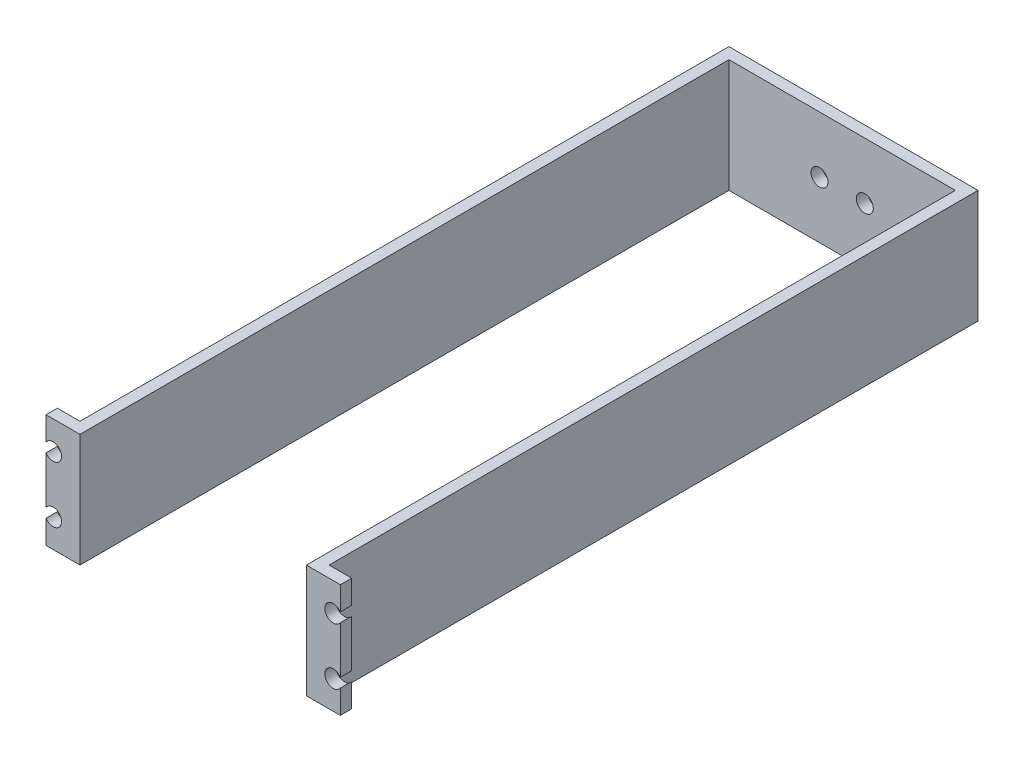
ISO-10303-21;
HEADER;
FILE_DESCRIPTION(('STEP AP214'),'2;1');
FILE_NAME('part.step','',(''),(''),'','','');
FILE_SCHEMA(('AUTOMOTIVE_DESIGN { 1 0 10303 214 1 1 1 1 }'));
ENDSEC;
DATA;
#1=APPLICATION_CONTEXT('core data for automotive mechanical design processes');
#2=APPLICATION_PROTOCOL_DEFINITION('international standard','automotive_design',2000,#1);
#3=PRODUCT_CONTEXT('',#1,'mechanical');
#4=PRODUCT('Part','Part','',(#3));
#5=PRODUCT_RELATED_PRODUCT_CATEGORY('part','',(#4));
#6=PRODUCT_DEFINITION_FORMATION('','',#4);
#7=PRODUCT_DEFINITION_CONTEXT('part definition',#1,'design');
#8=PRODUCT_DEFINITION('design','',#6,#7);
#9=PRODUCT_DEFINITION_SHAPE('','',#8);
#10=(LENGTH_UNIT() NAMED_UNIT(*) SI_UNIT(.MILLI.,.METRE.));
#11=(NAMED_UNIT(*) PLANE_ANGLE_UNIT() SI_UNIT($,.RADIAN.));
#12=(NAMED_UNIT(*) SI_UNIT($,.STERADIAN.) SOLID_ANGLE_UNIT());
#13=UNCERTAINTY_MEASURE_WITH_UNIT(LENGTH_MEASURE(1.E-05),#10,'distance_accuracy_value','');
#14=(GEOMETRIC_REPRESENTATION_CONTEXT(3) GLOBAL_UNCERTAINTY_ASSIGNED_CONTEXT((#13)) GLOBAL_UNIT_ASSIGNED_CONTEXT((#10,
#11,#12)) REPRESENTATION_CONTEXT('',''));
#15=CARTESIAN_POINT('',(0.,0.,0.));
#16=DIRECTION('',(0.,0.,1.));
#17=DIRECTION('',(1.,0.,0.));
#18=AXIS2_PLACEMENT_3D('',#15,#16,#17);
#19=CARTESIAN_POINT('',(-4.,0.,0.));
#20=DIRECTION('',(1.,0.,0.));
#21=DIRECTION('',(0.,0.,-1.));
#22=AXIS2_PLACEMENT_3D('',#19,#20,#21);
#23=PLANE('',#22);
#24=DIRECTION('',(0.,-1.,0.));
#25=VECTOR('',#24,1.);
#26=CARTESIAN_POINT('',(-4.,20.,114.65));
#27=LINE('',#26,#25);
#28=CARTESIAN_POINT('',(-4.,20.,114.65));
#29=VERTEX_POINT('',#28);
#30=CARTESIAN_POINT('',(-4.,15.8291561975888,114.65));
#31=VERTEX_POINT('',#30);
#32=EDGE_CURVE('E234',#29,#31,#27,.T.);
#33=ORIENTED_EDGE('',*,*,#32,.T.);
#34=DIRECTION('',(0.,0.,1.));
#35=VECTOR('',#34,1.);
#36=CARTESIAN_POINT('',(-4.,15.8291561975888,112.65));
#37=LINE('',#36,#35);
#38=CARTESIAN_POINT('',(-4.,15.8291561975888,116.65));
#39=VERTEX_POINT('',#38);
#40=EDGE_CURVE('E11',#31,#39,#37,.T.);
#41=ORIENTED_EDGE('',*,*,#40,.T.);
#42=DIRECTION('',(0.,1.,0.));
#43=VECTOR('',#42,1.);
#44=CARTESIAN_POINT('',(-4.,20.,116.65));
#45=LINE('',#44,#43);
#46=CARTESIAN_POINT('',(-4.,20.,116.65));
#47=VERTEX_POINT('',#46);
#48=EDGE_CURVE('E231',#39,#47,#45,.T.);
#49=ORIENTED_EDGE('',*,*,#48,.T.);
#50=DIRECTION('',(0.,0.,-1.));
#51=VECTOR('',#50,1.);
#52=CARTESIAN_POINT('',(-4.,20.,116.65));
#53=LINE('',#52,#51);
#54=EDGE_CURVE('E229',#47,#29,#53,.T.);
#55=ORIENTED_EDGE('',*,*,#54,.T.);
#56=EDGE_LOOP('',(#33,#41,#49,#55));
#57=FACE_BOUND('',#56,.T.);
#58=ADVANCED_FACE('F35',(#57),#23,.F.);
#59=CARTESIAN_POINT('',(-4.,5.82915619758885,116.65));
#60=VERTEX_POINT('',#59);
#61=CARTESIAN_POINT('',(-4.,14.1708438024112,116.65));
#62=VERTEX_POINT('',#61);
#63=EDGE_CURVE('E230',#60,#62,#45,.T.);
#64=ORIENTED_EDGE('',*,*,#63,.T.);
#65=DIRECTION('',(0.,0.,1.));
#66=VECTOR('',#65,1.);
#67=CARTESIAN_POINT('',(-4.,14.1708438024112,112.65));
#68=LINE('',#67,#66);
#69=CARTESIAN_POINT('',(-4.,14.1708438024112,114.65));
#70=VERTEX_POINT('',#69);
#71=EDGE_CURVE('E43',#62,#70,#68,.F.);
#72=ORIENTED_EDGE('',*,*,#71,.T.);
#73=CARTESIAN_POINT('',(-4.,5.82915619758885,114.65));
#74=VERTEX_POINT('',#73);
#75=EDGE_CURVE('E238',#70,#74,#27,.T.);
#76=ORIENTED_EDGE('',*,*,#75,.T.);
#77=DIRECTION('',(0.,0.,1.));
#78=VECTOR('',#77,1.);
#79=CARTESIAN_POINT('',(-4.,5.82915619758885,112.65));
#80=LINE('',#79,#78);
#81=EDGE_CURVE('E315',#74,#60,#80,.T.);
#82=ORIENTED_EDGE('',*,*,#81,.T.);
#83=EDGE_LOOP('',(#64,#72,#76,#82));
#84=FACE_BOUND('',#83,.T.);
#85=ADVANCED_FACE('F321',(#84),#23,.F.);
#86=CARTESIAN_POINT('',(48.,0.,0.));
#87=DIRECTION('',(1.,0.,0.));
#88=DIRECTION('',(0.,0.,-1.));
#89=AXIS2_PLACEMENT_3D('',#86,#87,#88);
#90=PLANE('',#89);
#91=DIRECTION('',(0.,0.,1.));
#92=VECTOR('',#91,1.);
#93=CARTESIAN_POINT('',(48.,5.82915619758885,112.65));
#94=LINE('',#93,#92);
#95=CARTESIAN_POINT('',(48.,5.82915619758885,114.65));
#96=VERTEX_POINT('',#95);
#97=CARTESIAN_POINT('',(48.,5.82915619758885,116.65));
#98=VERTEX_POINT('',#97);
#99=EDGE_CURVE('E171',#96,#98,#94,.T.);
#100=ORIENTED_EDGE('',*,*,#99,.F.);
#101=DIRECTION('',(0.,1.,0.));
#102=VECTOR('',#101,1.);
#103=CARTESIAN_POINT('',(48.,20.,114.65));
#104=LINE('',#103,#102);
#105=CARTESIAN_POINT('',(48.,14.1708438024112,114.65));
#106=VERTEX_POINT('',#105);
#107=EDGE_CURVE('E213',#96,#106,#104,.T.);
#108=ORIENTED_EDGE('',*,*,#107,.T.);
#109=DIRECTION('',(0.,0.,1.));
#110=VECTOR('',#109,1.);
#111=CARTESIAN_POINT('',(48.,14.1708438024112,112.65));
#112=LINE('',#111,#110);
#113=CARTESIAN_POINT('',(48.,14.1708438024112,116.65));
#114=VERTEX_POINT('',#113);
#115=EDGE_CURVE('E197',#114,#106,#112,.F.);
#116=ORIENTED_EDGE('',*,*,#115,.F.);
#117=DIRECTION('',(0.,-1.,0.));
#118=VECTOR('',#117,1.);
#119=CARTESIAN_POINT('',(48.,20.,116.65));
#120=LINE('',#119,#118);
#121=EDGE_CURVE('E189',#114,#98,#120,.T.);
#122=ORIENTED_EDGE('',*,*,#121,.T.);
#123=EDGE_LOOP('',(#100,#108,#116,#122));
#124=FACE_BOUND('',#123,.T.);
#125=ADVANCED_FACE('F195',(#124),#90,.T.);
#126=DIRECTION('',(0.,0.,1.));
#127=VECTOR('',#126,1.);
#128=CARTESIAN_POINT('',(48.,15.8291561975888,112.65));
#129=LINE('',#128,#127);
#130=CARTESIAN_POINT('',(48.,15.8291561975888,114.65));
#131=VERTEX_POINT('',#130);
#132=CARTESIAN_POINT('',(48.,15.8291561975888,116.65));
#133=VERTEX_POINT('',#132);
#134=EDGE_CURVE('E311',#131,#133,#129,.T.);
#135=ORIENTED_EDGE('',*,*,#134,.F.);
#136=CARTESIAN_POINT('',(48.,20.,114.65));
#137=VERTEX_POINT('',#136);
#138=EDGE_CURVE('E208',#131,#137,#104,.T.);
#139=ORIENTED_EDGE('',*,*,#138,.T.);
#140=DIRECTION('',(0.,0.,1.));
#141=VECTOR('',#140,1.);
#142=CARTESIAN_POINT('',(48.,20.,116.65));
#143=LINE('',#142,#141);
#144=CARTESIAN_POINT('',(48.,20.,116.65));
#145=VERTEX_POINT('',#144);
#146=EDGE_CURVE('E212',#137,#145,#143,.T.);
#147=ORIENTED_EDGE('',*,*,#146,.T.);
#148=EDGE_CURVE('E198',#145,#133,#120,.T.);
#149=ORIENTED_EDGE('',*,*,#148,.T.);
#150=EDGE_LOOP('',(#135,#139,#147,#149));
#151=FACE_BOUND('',#150,.T.);
#152=ADVANCED_FACE('F384',(#151),#90,.T.);
#153=CARTESIAN_POINT('',(44.,0.,2.));
#154=DIRECTION('',(-1.,0.,0.));
#155=DIRECTION('',(0.,0.,1.));
#156=AXIS2_PLACEMENT_3D('',#153,#154,#155);
#157=PLANE('',#156);
#158=DIRECTION('',(0.,1.,0.));
#159=VECTOR('',#158,1.);
#160=CARTESIAN_POINT('',(44.,20.,114.65));
#161=LINE('',#160,#159);
#162=CARTESIAN_POINT('',(44.,0.,114.65));
#163=VERTEX_POINT('',#162);
#164=CARTESIAN_POINT('',(44.,20.,114.65));
#165=VERTEX_POINT('',#164);
#166=EDGE_CURVE('E202',#163,#165,#161,.T.);
#167=ORIENTED_EDGE('',*,*,#166,.F.);
#168=DIRECTION('',(0.,0.,-1.));
#169=VECTOR('',#168,1.);
#170=CARTESIAN_POINT('',(44.,0.,2.));
#171=LINE('',#170,#169);
#172=CARTESIAN_POINT('',(44.,0.,0.));
#173=VERTEX_POINT('',#172);
#174=EDGE_CURVE('E300',#163,#173,#171,.T.);
#175=ORIENTED_EDGE('',*,*,#174,.T.);
#176=DIRECTION('',(0.,1.,0.));
#177=VECTOR('',#176,1.);
#178=CARTESIAN_POINT('',(44.,0.,0.));
#179=LINE('',#178,#177);
#180=CARTESIAN_POINT('',(44.,20.,0.));
#181=VERTEX_POINT('',#180);
#182=EDGE_CURVE('E292',#173,#181,#179,.T.);
#183=ORIENTED_EDGE('',*,*,#182,.T.);
#184=DIRECTION('',(0.,0.,-1.));
#185=VECTOR('',#184,1.);
#186=CARTESIAN_POINT('',(44.,20.,2.));
#187=LINE('',#186,#185);
#188=EDGE_CURVE('E298',#165,#181,#187,.T.);
#189=ORIENTED_EDGE('',*,*,#188,.F.);
#190=EDGE_LOOP('',(#167,#175,#183,#189));
#191=FACE_BOUND('',#190,.T.);
#192=ADVANCED_FACE('F392',(#191),#157,.F.);
#193=CARTESIAN_POINT('',(0.,0.,2.));
#194=DIRECTION('',(1.,0.,0.));
#195=DIRECTION('',(0.,0.,-1.));
#196=AXIS2_PLACEMENT_3D('',#193,#194,#195);
#197=PLANE('',#196);
#198=DIRECTION('',(0.,-1.,0.));
#199=VECTOR('',#198,1.);
#200=CARTESIAN_POINT('',(0.,20.,114.65));
#201=LINE('',#200,#199);
#202=CARTESIAN_POINT('',(0.,20.,114.65));
#203=VERTEX_POINT('',#202);
#204=CARTESIAN_POINT('',(0.,0.,114.65));
#205=VERTEX_POINT('',#204);
#206=EDGE_CURVE('E225',#203,#205,#201,.T.);
#207=ORIENTED_EDGE('',*,*,#206,.F.);
#208=DIRECTION('',(0.,0.,-1.));
#209=VECTOR('',#208,1.);
#210=CARTESIAN_POINT('',(0.,20.,2.));
#211=LINE('',#210,#209);
#212=CARTESIAN_POINT('',(0.,20.,0.));
#213=VERTEX_POINT('',#212);
#214=EDGE_CURVE('E286',#203,#213,#211,.T.);
#215=ORIENTED_EDGE('',*,*,#214,.T.);
#216=DIRECTION('',(0.,-1.,0.));
#217=VECTOR('',#216,1.);
#218=CARTESIAN_POINT('',(0.,0.,0.));
#219=LINE('',#218,#217);
#220=CARTESIAN_POINT('',(0.,0.,0.));
#221=VERTEX_POINT('',#220);
#222=EDGE_CURVE('E280',#213,#221,#219,.T.);
#223=ORIENTED_EDGE('',*,*,#222,.T.);
#224=DIRECTION('',(0.,0.,-1.));
#225=VECTOR('',#224,1.);
#226=CARTESIAN_POINT('',(0.,0.,2.));
#227=LINE('',#226,#225);
#228=EDGE_CURVE('E302',#205,#221,#227,.T.);
#229=ORIENTED_EDGE('',*,*,#228,.F.);
#230=EDGE_LOOP('',(#207,#215,#223,#229));
#231=FACE_BOUND('',#230,.T.);
#232=ADVANCED_FACE('F37',(#231),#197,.F.);
#233=CARTESIAN_POINT('',(0.,0.,2.));
#234=DIRECTION('',(0.,0.,-1.));
#235=DIRECTION('',(-1.,0.,0.));
#236=AXIS2_PLACEMENT_3D('',#233,#234,#235);
#237=PLANE('',#236);
#238=CARTESIAN_POINT('',(26.,10.,2.));
#239=DIRECTION('',(0.,0.,1.));
#240=DIRECTION('',(1.,0.,0.));
#241=AXIS2_PLACEMENT_3D('',#238,#239,#240);
#242=CIRCLE('',#241,1.5);
#243=CARTESIAN_POINT('',(27.5,10.,2.));
#244=VERTEX_POINT('',#243);
#245=EDGE_CURVE('E309',#244,#244,#242,.T.);
#246=ORIENTED_EDGE('',*,*,#245,.F.);
#247=EDGE_LOOP('',(#246));
#248=FACE_BOUND('',#247,.T.);
#249=CARTESIAN_POINT('',(18.,10.,2.));
#250=DIRECTION('',(0.,0.,1.));
#251=DIRECTION('',(1.,0.,0.));
#252=AXIS2_PLACEMENT_3D('',#249,#250,#251);
#253=CIRCLE('',#252,1.5);
#254=CARTESIAN_POINT('',(19.5,10.,2.));
#255=VERTEX_POINT('',#254);
#256=EDGE_CURVE('E205',#255,#255,#253,.T.);
#257=ORIENTED_EDGE('',*,*,#256,.F.);
#258=EDGE_LOOP('',(#257));
#259=FACE_BOUND('',#258,.T.);
#260=DIRECTION('',(0.,-1.,0.));
#261=VECTOR('',#260,1.);
#262=CARTESIAN_POINT('',(42.,20.,2.));
#263=LINE('',#262,#261);
#264=CARTESIAN_POINT('',(42.,20.,2.));
#265=VERTEX_POINT('',#264);
#266=CARTESIAN_POINT('',(42.,0.,2.));
#267=VERTEX_POINT('',#266);
#268=EDGE_CURVE('E249',#265,#267,#263,.T.);
#269=ORIENTED_EDGE('',*,*,#268,.F.);
#270=DIRECTION('',(-1.,0.,0.));
#271=VECTOR('',#270,1.);
#272=CARTESIAN_POINT('',(0.,20.,2.));
#273=LINE('',#272,#271);
#274=CARTESIAN_POINT('',(2.,20.,2.));
#275=VERTEX_POINT('',#274);
#276=EDGE_CURVE('E283',#265,#275,#273,.T.);
#277=ORIENTED_EDGE('',*,*,#276,.T.);
#278=DIRECTION('',(0.,1.,0.));
#279=VECTOR('',#278,1.);
#280=CARTESIAN_POINT('',(2.,20.,2.));
#281=LINE('',#280,#279);
#282=CARTESIAN_POINT('',(2.,0.,2.));
#283=VERTEX_POINT('',#282);
#284=EDGE_CURVE('E264',#283,#275,#281,.T.);
#285=ORIENTED_EDGE('',*,*,#284,.F.);
#286=DIRECTION('',(1.,0.,0.));
#287=VECTOR('',#286,1.);
#288=CARTESIAN_POINT('',(0.,0.,2.));
#289=LINE('',#288,#287);
#290=EDGE_CURVE('E281',#283,#267,#289,.T.);
#291=ORIENTED_EDGE('',*,*,#290,.T.);
#292=EDGE_LOOP('',(#269,#277,#285,#291));
#293=FACE_BOUND('',#292,.T.);
#294=ADVANCED_FACE('F358',(#248,#259,#293),#237,.F.);
#295=CARTESIAN_POINT('',(0.,0.,2.));
#296=DIRECTION('',(0.,1.,0.));
#297=DIRECTION('',(0.,0.,1.));
#298=AXIS2_PLACEMENT_3D('',#295,#296,#297);
#299=PLANE('',#298);
#300=DIRECTION('',(1.,0.,0.));
#301=VECTOR('',#300,1.);
#302=CARTESIAN_POINT('',(0.,0.,0.));
#303=LINE('',#302,#301);
#304=EDGE_CURVE('E289',#221,#173,#303,.T.);
#305=ORIENTED_EDGE('',*,*,#304,.T.);
#306=ORIENTED_EDGE('',*,*,#174,.F.);
#307=DIRECTION('',(-1.,0.,0.));
#308=VECTOR('',#307,1.);
#309=CARTESIAN_POINT('',(48.,0.,114.65));
#310=LINE('',#309,#308);
#311=CARTESIAN_POINT('',(48.,0.,114.65));
#312=VERTEX_POINT('',#311);
#313=EDGE_CURVE('E222',#312,#163,#310,.T.);
#314=ORIENTED_EDGE('',*,*,#313,.F.);
#315=DIRECTION('',(0.,0.,-1.));
#316=VECTOR('',#315,1.);
#317=CARTESIAN_POINT('',(48.,0.,116.65));
#318=LINE('',#317,#316);
#319=CARTESIAN_POINT('',(48.,0.,116.65));
#320=VERTEX_POINT('',#319);
#321=EDGE_CURVE('E201',#320,#312,#318,.T.);
#322=ORIENTED_EDGE('',*,*,#321,.F.);
#323=DIRECTION('',(1.,0.,0.));
#324=VECTOR('',#323,1.);
#325=CARTESIAN_POINT('',(44.,0.,116.65));
#326=LINE('',#325,#324);
#327=CARTESIAN_POINT('',(42.,0.,116.65));
#328=VERTEX_POINT('',#327);
#329=EDGE_CURVE('E254',#328,#320,#326,.T.);
#330=ORIENTED_EDGE('',*,*,#329,.F.);
#331=DIRECTION('',(0.,0.,-1.));
#332=VECTOR('',#331,1.);
#333=CARTESIAN_POINT('',(42.,0.,116.65));
#334=LINE('',#333,#332);
#335=EDGE_CURVE('E256',#328,#267,#334,.T.);
#336=ORIENTED_EDGE('',*,*,#335,.T.);
#337=ORIENTED_EDGE('',*,*,#290,.F.);
#338=DIRECTION('',(0.,0.,-1.));
#339=VECTOR('',#338,1.);
#340=CARTESIAN_POINT('',(2.,0.,116.65));
#341=LINE('',#340,#339);
#342=CARTESIAN_POINT('',(2.,0.,116.65));
#343=VERTEX_POINT('',#342);
#344=EDGE_CURVE('E277',#343,#283,#341,.T.);
#345=ORIENTED_EDGE('',*,*,#344,.F.);
#346=DIRECTION('',(1.,0.,0.));
#347=VECTOR('',#346,1.);
#348=CARTESIAN_POINT('',(0.,0.,116.65));
#349=LINE('',#348,#347);
#350=CARTESIAN_POINT('',(-4.,0.,116.65));
#351=VERTEX_POINT('',#350);
#352=EDGE_CURVE('E265',#351,#343,#349,.T.);
#353=ORIENTED_EDGE('',*,*,#352,.F.);
#354=DIRECTION('',(0.,0.,1.));
#355=VECTOR('',#354,1.);
#356=CARTESIAN_POINT('',(-4.,0.,116.65));
#357=LINE('',#356,#355);
#358=CARTESIAN_POINT('',(-4.,0.,114.65));
#359=VERTEX_POINT('',#358);
#360=EDGE_CURVE('E237',#359,#351,#357,.T.);
#361=ORIENTED_EDGE('',*,*,#360,.F.);
#362=DIRECTION('',(1.,0.,0.));
#363=VECTOR('',#362,1.);
#364=CARTESIAN_POINT('',(-4.,0.,114.65));
#365=LINE('',#364,#363);
#366=EDGE_CURVE('E241',#359,#205,#365,.T.);
#367=ORIENTED_EDGE('',*,*,#366,.T.);
#368=ORIENTED_EDGE('',*,*,#228,.T.);
#369=EDGE_LOOP('',(#305,#306,#314,#322,#330,#336,#337,#345,#353,#361,#367,#368));
#370=FACE_BOUND('',#369,.T.);
#371=ADVANCED_FACE('F334',(#370),#299,.F.);
#372=CARTESIAN_POINT('',(0.,20.,2.));
#373=DIRECTION('',(0.,-1.,0.));
#374=DIRECTION('',(0.,0.,-1.));
#375=AXIS2_PLACEMENT_3D('',#372,#373,#374);
#376=PLANE('',#375);
#377=DIRECTION('',(-1.,0.,0.));
#378=VECTOR('',#377,1.);
#379=CARTESIAN_POINT('',(0.,20.,0.));
#380=LINE('',#379,#378);
#381=EDGE_CURVE('E284',#181,#213,#380,.T.);
#382=ORIENTED_EDGE('',*,*,#381,.T.);
#383=ORIENTED_EDGE('',*,*,#214,.F.);
#384=DIRECTION('',(1.,0.,0.));
#385=VECTOR('',#384,1.);
#386=CARTESIAN_POINT('',(-4.,20.,114.65));
#387=LINE('',#386,#385);
#388=EDGE_CURVE('E246',#29,#203,#387,.T.);
#389=ORIENTED_EDGE('',*,*,#388,.F.);
#390=ORIENTED_EDGE('',*,*,#54,.F.);
#391=DIRECTION('',(-1.,0.,0.));
#392=VECTOR('',#391,1.);
#393=CARTESIAN_POINT('',(0.,20.,116.65));
#394=LINE('',#393,#392);
#395=CARTESIAN_POINT('',(2.,20.,116.65));
#396=VERTEX_POINT('',#395);
#397=EDGE_CURVE('E269',#396,#47,#394,.T.);
#398=ORIENTED_EDGE('',*,*,#397,.F.);
#399=DIRECTION('',(0.,0.,-1.));
#400=VECTOR('',#399,1.);
#401=CARTESIAN_POINT('',(2.,20.,116.65));
#402=LINE('',#401,#400);
#403=EDGE_CURVE('E272',#396,#275,#402,.T.);
#404=ORIENTED_EDGE('',*,*,#403,.T.);
#405=ORIENTED_EDGE('',*,*,#276,.F.);
#406=DIRECTION('',(0.,0.,-1.));
#407=VECTOR('',#406,1.);
#408=CARTESIAN_POINT('',(42.,20.,116.65));
#409=LINE('',#408,#407);
#410=CARTESIAN_POINT('',(42.,20.,116.65));
#411=VERTEX_POINT('',#410);
#412=EDGE_CURVE('E261',#411,#265,#409,.T.);
#413=ORIENTED_EDGE('',*,*,#412,.F.);
#414=DIRECTION('',(-1.,0.,0.));
#415=VECTOR('',#414,1.);
#416=CARTESIAN_POINT('',(44.,20.,116.65));
#417=LINE('',#416,#415);
#418=EDGE_CURVE('E250',#145,#411,#417,.T.);
#419=ORIENTED_EDGE('',*,*,#418,.F.);
#420=ORIENTED_EDGE('',*,*,#146,.F.);
#421=DIRECTION('',(-1.,0.,0.));
#422=VECTOR('',#421,1.);
#423=CARTESIAN_POINT('',(48.,20.,114.65));
#424=LINE('',#423,#422);
#425=EDGE_CURVE('E216',#137,#165,#424,.T.);
#426=ORIENTED_EDGE('',*,*,#425,.T.);
#427=ORIENTED_EDGE('',*,*,#188,.T.);
#428=EDGE_LOOP('',(#382,#383,#389,#390,#398,#404,#405,#413,#419,#420,#426,#427));
#429=FACE_BOUND('',#428,.T.);
#430=ADVANCED_FACE('F372',(#429),#376,.F.);
#431=CARTESIAN_POINT('',(0.,0.,0.));
#432=DIRECTION('',(0.,0.,-1.));
#433=DIRECTION('',(-1.,0.,0.));
#434=AXIS2_PLACEMENT_3D('',#431,#432,#433);
#435=PLANE('',#434);
#436=CARTESIAN_POINT('',(26.,10.,0.));
#437=DIRECTION('',(0.,0.,-1.));
#438=DIRECTION('',(-1.,0.,0.));
#439=AXIS2_PLACEMENT_3D('',#436,#437,#438);
#440=CIRCLE('',#439,1.5);
#441=CARTESIAN_POINT('',(24.5,10.,0.));
#442=VERTEX_POINT('',#441);
#443=EDGE_CURVE('E306',#442,#442,#440,.T.);
#444=ORIENTED_EDGE('',*,*,#443,.F.);
#445=EDGE_LOOP('',(#444));
#446=FACE_BOUND('',#445,.T.);
#447=CARTESIAN_POINT('',(18.,10.,0.));
#448=DIRECTION('',(0.,0.,-1.));
#449=DIRECTION('',(-1.,0.,0.));
#450=AXIS2_PLACEMENT_3D('',#447,#448,#449);
#451=CIRCLE('',#450,1.5);
#452=CARTESIAN_POINT('',(16.5,10.,0.));
#453=VERTEX_POINT('',#452);
#454=EDGE_CURVE('E219',#453,#453,#451,.T.);
#455=ORIENTED_EDGE('',*,*,#454,.F.);
#456=EDGE_LOOP('',(#455));
#457=FACE_BOUND('',#456,.T.);
#458=ORIENTED_EDGE('',*,*,#222,.F.);
#459=ORIENTED_EDGE('',*,*,#381,.F.);
#460=ORIENTED_EDGE('',*,*,#182,.F.);
#461=ORIENTED_EDGE('',*,*,#304,.F.);
#462=EDGE_LOOP('',(#458,#459,#460,#461));
#463=FACE_BOUND('',#462,.T.);
#464=ADVANCED_FACE('F398',(#446,#457,#463),#435,.T.);
#465=CARTESIAN_POINT('',(2.,20.,116.65));
#466=DIRECTION('',(-1.,0.,0.));
#467=DIRECTION('',(0.,-1.,0.));
#468=AXIS2_PLACEMENT_3D('',#465,#466,#467);
#469=PLANE('',#468);
#470=ORIENTED_EDGE('',*,*,#284,.T.);
#471=ORIENTED_EDGE('',*,*,#403,.F.);
#472=DIRECTION('',(0.,1.,0.));
#473=VECTOR('',#472,1.);
#474=CARTESIAN_POINT('',(2.,20.,116.65));
#475=LINE('',#474,#473);
#476=EDGE_CURVE('E267',#343,#396,#475,.T.);
#477=ORIENTED_EDGE('',*,*,#476,.F.);
#478=ORIENTED_EDGE('',*,*,#344,.T.);
#479=EDGE_LOOP('',(#470,#471,#477,#478));
#480=FACE_BOUND('',#479,.T.);
#481=ADVANCED_FACE('F377',(#480),#469,.F.);
#482=CARTESIAN_POINT('',(0.,0.,116.65));
#483=DIRECTION('',(0.,0.,1.));
#484=DIRECTION('',(1.,0.,0.));
#485=AXIS2_PLACEMENT_3D('',#482,#483,#484);
#486=PLANE('',#485);
#487=CARTESIAN_POINT('',(-2.75,15.,116.65));
#488=DIRECTION('',(0.,0.,1.));
#489=DIRECTION('',(1.,0.,0.));
#490=AXIS2_PLACEMENT_3D('',#487,#488,#489);
#491=CIRCLE('',#490,1.5);
#492=EDGE_CURVE('E192',#62,#39,#491,.T.);
#493=ORIENTED_EDGE('',*,*,#492,.F.);
#494=ORIENTED_EDGE('',*,*,#63,.F.);
#495=CARTESIAN_POINT('',(-2.75,5.,116.65));
#496=DIRECTION('',(0.,0.,1.));
#497=DIRECTION('',(1.,0.,0.));
#498=AXIS2_PLACEMENT_3D('',#495,#496,#497);
#499=CIRCLE('',#498,1.5);
#500=CARTESIAN_POINT('',(-4.,4.17084380241115,116.65));
#501=VERTEX_POINT('',#500);
#502=EDGE_CURVE('E342',#501,#60,#499,.T.);
#503=ORIENTED_EDGE('',*,*,#502,.F.);
#504=EDGE_CURVE('E226',#351,#501,#45,.T.);
#505=ORIENTED_EDGE('',*,*,#504,.F.);
#506=ORIENTED_EDGE('',*,*,#352,.T.);
#507=ORIENTED_EDGE('',*,*,#476,.T.);
#508=ORIENTED_EDGE('',*,*,#397,.T.);
#509=ORIENTED_EDGE('',*,*,#48,.F.);
#510=EDGE_LOOP('',(#493,#494,#503,#505,#506,#507,#508,#509));
#511=FACE_BOUND('',#510,.T.);
#512=ADVANCED_FACE('F339',(#511),#486,.T.);
#513=CARTESIAN_POINT('',(42.,20.,116.65));
#514=DIRECTION('',(1.,0.,0.));
#515=DIRECTION('',(0.,0.,-1.));
#516=AXIS2_PLACEMENT_3D('',#513,#514,#515);
#517=PLANE('',#516);
#518=ORIENTED_EDGE('',*,*,#268,.T.);
#519=ORIENTED_EDGE('',*,*,#335,.F.);
#520=DIRECTION('',(0.,-1.,0.));
#521=VECTOR('',#520,1.);
#522=CARTESIAN_POINT('',(42.,20.,116.65));
#523=LINE('',#522,#521);
#524=EDGE_CURVE('E252',#411,#328,#523,.T.);
#525=ORIENTED_EDGE('',*,*,#524,.F.);
#526=ORIENTED_EDGE('',*,*,#412,.T.);
#527=EDGE_LOOP('',(#518,#519,#525,#526));
#528=FACE_BOUND('',#527,.T.);
#529=ADVANCED_FACE('F370',(#528),#517,.F.);
#530=CARTESIAN_POINT('',(0.,0.,116.65));
#531=DIRECTION('',(0.,0.,-1.));
#532=DIRECTION('',(-1.,0.,0.));
#533=AXIS2_PLACEMENT_3D('',#530,#531,#532);
#534=PLANE('',#533);
#535=CARTESIAN_POINT('',(48.,4.17084380241115,116.65));
#536=VERTEX_POINT('',#535);
#537=EDGE_CURVE('E191',#536,#320,#120,.T.);
#538=ORIENTED_EDGE('',*,*,#537,.F.);
#539=CARTESIAN_POINT('',(46.75,5.,116.65));
#540=DIRECTION('',(0.,0.,1.));
#541=DIRECTION('',(1.,0.,0.));
#542=AXIS2_PLACEMENT_3D('',#539,#540,#541);
#543=CIRCLE('',#542,1.5);
#544=EDGE_CURVE('E174',#98,#536,#543,.T.);
#545=ORIENTED_EDGE('',*,*,#544,.F.);
#546=ORIENTED_EDGE('',*,*,#121,.F.);
#547=CARTESIAN_POINT('',(46.75,15.,116.65));
#548=DIRECTION('',(0.,0.,1.));
#549=DIRECTION('',(1.,0.,0.));
#550=AXIS2_PLACEMENT_3D('',#547,#548,#549);
#551=CIRCLE('',#550,1.5);
#552=EDGE_CURVE('E349',#133,#114,#551,.T.);
#553=ORIENTED_EDGE('',*,*,#552,.F.);
#554=ORIENTED_EDGE('',*,*,#148,.F.);
#555=ORIENTED_EDGE('',*,*,#418,.T.);
#556=ORIENTED_EDGE('',*,*,#524,.T.);
#557=ORIENTED_EDGE('',*,*,#329,.T.);
#558=EDGE_LOOP('',(#538,#545,#546,#553,#554,#555,#556,#557));
#559=FACE_BOUND('',#558,.T.);
#560=ADVANCED_FACE('F187',(#559),#534,.F.);
#561=CARTESIAN_POINT('',(-4.,20.,114.65));
#562=DIRECTION('',(0.,0.,1.));
#563=DIRECTION('',(1.,0.,0.));
#564=AXIS2_PLACEMENT_3D('',#561,#562,#563);
#565=PLANE('',#564);
#566=ORIENTED_EDGE('',*,*,#75,.F.);
#567=CARTESIAN_POINT('',(-2.75,15.,114.65));
#568=DIRECTION('',(0.,0.,1.));
#569=DIRECTION('',(1.,0.,0.));
#570=AXIS2_PLACEMENT_3D('',#567,#568,#569);
#571=CIRCLE('',#570,1.5);
#572=EDGE_CURVE('E58',#70,#31,#571,.T.);
#573=ORIENTED_EDGE('',*,*,#572,.T.);
#574=ORIENTED_EDGE('',*,*,#32,.F.);
#575=ORIENTED_EDGE('',*,*,#388,.T.);
#576=ORIENTED_EDGE('',*,*,#206,.T.);
#577=ORIENTED_EDGE('',*,*,#366,.F.);
#578=CARTESIAN_POINT('',(-4.,4.17084380241115,114.65));
#579=VERTEX_POINT('',#578);
#580=EDGE_CURVE('E233',#579,#359,#27,.T.);
#581=ORIENTED_EDGE('',*,*,#580,.F.);
#582=CARTESIAN_POINT('',(-2.75,5.,114.65));
#583=DIRECTION('',(0.,0.,1.));
#584=DIRECTION('',(1.,0.,0.));
#585=AXIS2_PLACEMENT_3D('',#582,#583,#584);
#586=CIRCLE('',#585,1.5);
#587=EDGE_CURVE('E50',#579,#74,#586,.T.);
#588=ORIENTED_EDGE('',*,*,#587,.T.);
#589=EDGE_LOOP('',(#566,#573,#574,#575,#576,#577,#581,#588));
#590=FACE_BOUND('',#589,.T.);
#591=ADVANCED_FACE('F325',(#590),#565,.F.);
#592=ORIENTED_EDGE('',*,*,#504,.T.);
#593=DIRECTION('',(0.,0.,1.));
#594=VECTOR('',#593,1.);
#595=CARTESIAN_POINT('',(-4.,4.17084380241115,112.65));
#596=LINE('',#595,#594);
#597=EDGE_CURVE('E181',#501,#579,#596,.F.);
#598=ORIENTED_EDGE('',*,*,#597,.T.);
#599=ORIENTED_EDGE('',*,*,#580,.T.);
#600=ORIENTED_EDGE('',*,*,#360,.T.);
#601=EDGE_LOOP('',(#592,#598,#599,#600));
#602=FACE_BOUND('',#601,.T.);
#603=ADVANCED_FACE('F330',(#602),#23,.F.);
#604=CARTESIAN_POINT('',(48.,20.,114.65));
#605=DIRECTION('',(0.,0.,1.));
#606=DIRECTION('',(1.,0.,0.));
#607=AXIS2_PLACEMENT_3D('',#604,#605,#606);
#608=PLANE('',#607);
#609=ORIENTED_EDGE('',*,*,#107,.F.);
#610=CARTESIAN_POINT('',(46.75,5.,114.65));
#611=DIRECTION('',(0.,0.,1.));
#612=DIRECTION('',(1.,0.,0.));
#613=AXIS2_PLACEMENT_3D('',#610,#611,#612);
#614=CIRCLE('',#613,1.5);
#615=CARTESIAN_POINT('',(48.,4.17084380241116,114.65));
#616=VERTEX_POINT('',#615);
#617=EDGE_CURVE('E177',#96,#616,#614,.T.);
#618=ORIENTED_EDGE('',*,*,#617,.T.);
#619=EDGE_CURVE('E209',#312,#616,#104,.T.);
#620=ORIENTED_EDGE('',*,*,#619,.F.);
#621=ORIENTED_EDGE('',*,*,#313,.T.);
#622=ORIENTED_EDGE('',*,*,#166,.T.);
#623=ORIENTED_EDGE('',*,*,#425,.F.);
#624=ORIENTED_EDGE('',*,*,#138,.F.);
#625=CARTESIAN_POINT('',(46.75,15.,114.65));
#626=DIRECTION('',(0.,0.,1.));
#627=DIRECTION('',(1.,0.,0.));
#628=AXIS2_PLACEMENT_3D('',#625,#626,#627);
#629=CIRCLE('',#628,1.5);
#630=EDGE_CURVE('E351',#131,#106,#629,.T.);
#631=ORIENTED_EDGE('',*,*,#630,.T.);
#632=EDGE_LOOP('',(#609,#618,#620,#621,#622,#623,#624,#631));
#633=FACE_BOUND('',#632,.T.);
#634=ADVANCED_FACE('F388',(#633),#608,.F.);
#635=DIRECTION('',(0.,0.,1.));
#636=VECTOR('',#635,1.);
#637=CARTESIAN_POINT('',(48.,4.17084380241116,112.65));
#638=LINE('',#637,#636);
#639=EDGE_CURVE('E182',#536,#616,#638,.F.);
#640=ORIENTED_EDGE('',*,*,#639,.F.);
#641=ORIENTED_EDGE('',*,*,#537,.T.);
#642=ORIENTED_EDGE('',*,*,#321,.T.);
#643=ORIENTED_EDGE('',*,*,#619,.T.);
#644=EDGE_LOOP('',(#640,#641,#642,#643));
#645=FACE_BOUND('',#644,.T.);
#646=ADVANCED_FACE('F425',(#645),#90,.T.);
#647=CARTESIAN_POINT('',(18.,10.,-2.));
#648=DIRECTION('',(0.,0.,1.));
#649=DIRECTION('',(1.,0.,0.));
#650=AXIS2_PLACEMENT_3D('',#647,#648,#649);
#651=CYLINDRICAL_SURFACE('',#650,1.5);
#652=ORIENTED_EDGE('',*,*,#454,.T.);
#653=EDGE_LOOP('',(#652));
#654=FACE_BOUND('',#653,.T.);
#655=ORIENTED_EDGE('',*,*,#256,.T.);
#656=EDGE_LOOP('',(#655));
#657=FACE_BOUND('',#656,.T.);
#658=ADVANCED_FACE('F502',(#654,#657),#651,.F.);
#659=CARTESIAN_POINT('',(26.,10.,-2.));
#660=DIRECTION('',(0.,0.,1.));
#661=DIRECTION('',(1.,0.,0.));
#662=AXIS2_PLACEMENT_3D('',#659,#660,#661);
#663=CYLINDRICAL_SURFACE('',#662,1.5);
#664=ORIENTED_EDGE('',*,*,#443,.T.);
#665=EDGE_LOOP('',(#664));
#666=FACE_BOUND('',#665,.T.);
#667=ORIENTED_EDGE('',*,*,#245,.T.);
#668=EDGE_LOOP('',(#667));
#669=FACE_BOUND('',#668,.T.);
#670=ADVANCED_FACE('F356',(#666,#669),#663,.F.);
#671=CARTESIAN_POINT('',(46.75,15.,112.65));
#672=DIRECTION('',(0.,0.,1.));
#673=DIRECTION('',(1.,0.,0.));
#674=AXIS2_PLACEMENT_3D('',#671,#672,#673);
#675=CYLINDRICAL_SURFACE('',#674,1.5);
#676=ORIENTED_EDGE('',*,*,#134,.T.);
#677=ORIENTED_EDGE('',*,*,#552,.T.);
#678=ORIENTED_EDGE('',*,*,#115,.T.);
#679=ORIENTED_EDGE('',*,*,#630,.F.);
#680=EDGE_LOOP('',(#676,#677,#678,#679));
#681=FACE_BOUND('',#680,.T.);
#682=ADVANCED_FACE('F510',(#681),#675,.F.);
#683=CARTESIAN_POINT('',(46.75,5.,112.65));
#684=DIRECTION('',(0.,0.,1.));
#685=DIRECTION('',(1.,0.,0.));
#686=AXIS2_PLACEMENT_3D('',#683,#684,#685);
#687=CYLINDRICAL_SURFACE('',#686,1.5);
#688=ORIENTED_EDGE('',*,*,#99,.T.);
#689=ORIENTED_EDGE('',*,*,#544,.T.);
#690=ORIENTED_EDGE('',*,*,#639,.T.);
#691=ORIENTED_EDGE('',*,*,#617,.F.);
#692=EDGE_LOOP('',(#688,#689,#690,#691));
#693=FACE_BOUND('',#692,.T.);
#694=ADVANCED_FACE('F173',(#693),#687,.F.);
#695=CARTESIAN_POINT('',(-2.75,5.,112.65));
#696=DIRECTION('',(0.,0.,1.));
#697=DIRECTION('',(1.,0.,0.));
#698=AXIS2_PLACEMENT_3D('',#695,#696,#697);
#699=CYLINDRICAL_SURFACE('',#698,1.5);
#700=ORIENTED_EDGE('',*,*,#587,.F.);
#701=ORIENTED_EDGE('',*,*,#597,.F.);
#702=ORIENTED_EDGE('',*,*,#502,.T.);
#703=ORIENTED_EDGE('',*,*,#81,.F.);
#704=EDGE_LOOP('',(#700,#701,#702,#703));
#705=FACE_BOUND('',#704,.T.);
#706=ADVANCED_FACE('F406',(#705),#699,.F.);
#707=CARTESIAN_POINT('',(-2.75,15.,112.65));
#708=DIRECTION('',(0.,0.,1.));
#709=DIRECTION('',(1.,0.,0.));
#710=AXIS2_PLACEMENT_3D('',#707,#708,#709);
#711=CYLINDRICAL_SURFACE('',#710,1.5);
#712=ORIENTED_EDGE('',*,*,#572,.F.);
#713=ORIENTED_EDGE('',*,*,#71,.F.);
#714=ORIENTED_EDGE('',*,*,#492,.T.);
#715=ORIENTED_EDGE('',*,*,#40,.F.);
#716=EDGE_LOOP('',(#712,#713,#714,#715));
#717=FACE_BOUND('',#716,.T.);
#718=ADVANCED_FACE('F404',(#717),#711,.F.);
#719=CLOSED_SHELL('',(#58,#85,#125,#152,#192,#232,#294,#371,#430,#464,#481,#512,#529,#560,#591,
#603,#634,#646,#658,#670,#682,#694,#706,#718));
#720=MANIFOLD_SOLID_BREP('B2',#719);
#721=ADVANCED_BREP_SHAPE_REPRESENTATION('',(#18,#720),#14);
#722=SHAPE_DEFINITION_REPRESENTATION(#9,#721);
ENDSEC;
END-ISO-10303-21;
